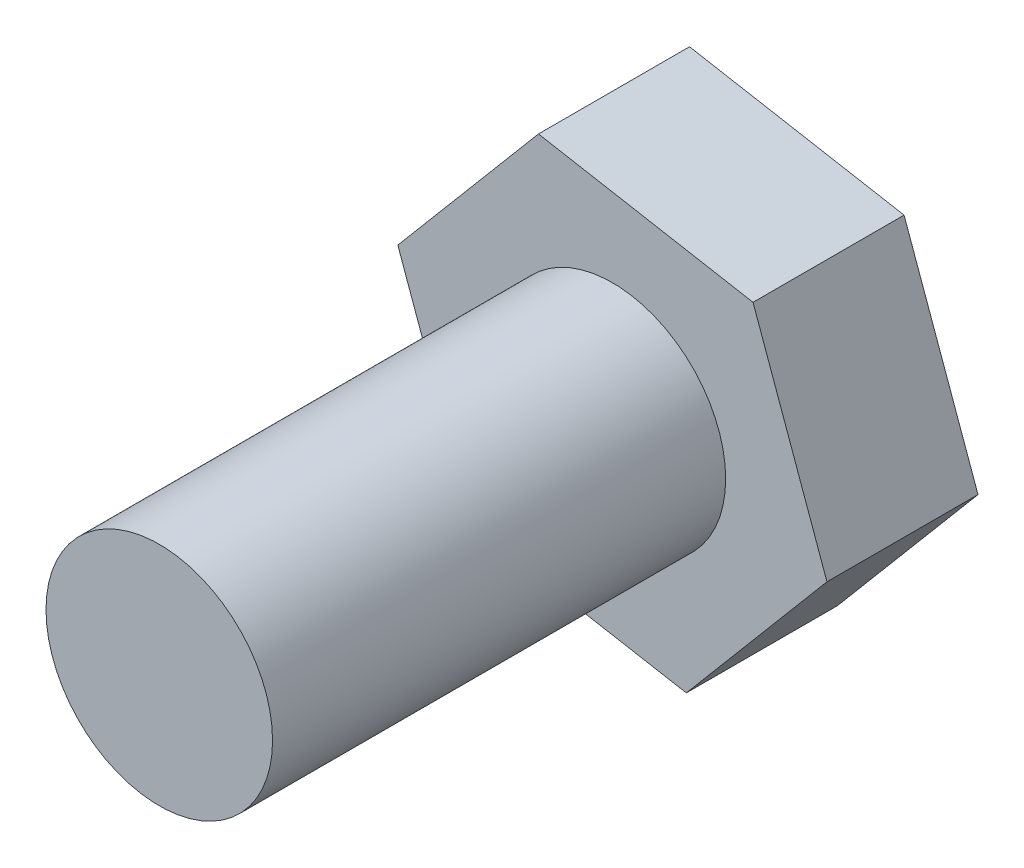
ISO-10303-21;
HEADER;
FILE_DESCRIPTION(('STEP AP214'),'2;1');
FILE_NAME('part.step','',(''),(''),'','','');
FILE_SCHEMA(('AUTOMOTIVE_DESIGN { 1 0 10303 214 1 1 1 1 }'));
ENDSEC;
DATA;
#1=APPLICATION_CONTEXT('core data for automotive mechanical design processes');
#2=APPLICATION_PROTOCOL_DEFINITION('international standard','automotive_design',2000,#1);
#3=PRODUCT_CONTEXT('',#1,'mechanical');
#4=PRODUCT('Part','Part','',(#3));
#5=PRODUCT_RELATED_PRODUCT_CATEGORY('part','',(#4));
#6=PRODUCT_DEFINITION_FORMATION('','',#4);
#7=PRODUCT_DEFINITION_CONTEXT('part definition',#1,'design');
#8=PRODUCT_DEFINITION('design','',#6,#7);
#9=PRODUCT_DEFINITION_SHAPE('','',#8);
#10=(LENGTH_UNIT() NAMED_UNIT(*) SI_UNIT(.MILLI.,.METRE.));
#11=(NAMED_UNIT(*) PLANE_ANGLE_UNIT() SI_UNIT($,.RADIAN.));
#12=(NAMED_UNIT(*) SI_UNIT($,.STERADIAN.) SOLID_ANGLE_UNIT());
#13=UNCERTAINTY_MEASURE_WITH_UNIT(LENGTH_MEASURE(1.E-05),#10,'distance_accuracy_value','');
#14=(GEOMETRIC_REPRESENTATION_CONTEXT(3) GLOBAL_UNCERTAINTY_ASSIGNED_CONTEXT((#13)) GLOBAL_UNIT_ASSIGNED_CONTEXT((#10,
#11,#12)) REPRESENTATION_CONTEXT('',''));
#15=CARTESIAN_POINT('',(0.,0.,0.));
#16=DIRECTION('',(0.,0.,1.));
#17=DIRECTION('',(1.,0.,0.));
#18=AXIS2_PLACEMENT_3D('',#15,#16,#17);
#19=CARTESIAN_POINT('',(0.,0.,4.));
#20=DIRECTION('',(0.,0.,1.));
#21=DIRECTION('',(1.,0.,0.));
#22=AXIS2_PLACEMENT_3D('',#19,#20,#21);
#23=PLANE('',#22);
#24=DIRECTION('',(0.339123555075527,-0.940741842586443,0.));
#25=VECTOR('',#24,1.);
#26=CARTESIAN_POINT('',(-5.68267459198921,1.0200700048985,4.));
#27=LINE('',#26,#25);
#28=CARTESIAN_POINT('',(-5.68267459198921,1.0200700048985,4.));
#29=VERTEX_POINT('',#28);
#30=CARTESIAN_POINT('',(-3.72474383387522,-4.41130555565377,4.));
#31=VERTEX_POINT('',#30);
#32=EDGE_CURVE('E133',#29,#31,#27,.T.);
#33=ORIENTED_EDGE('',*,*,#32,.T.);
#34=DIRECTION('',(0.984268111620605,-0.176681307576124,0.));
#35=VECTOR('',#34,1.);
#36=CARTESIAN_POINT('',(-3.72474383387522,-4.41130555565377,4.));
#37=LINE('',#36,#35);
#38=CARTESIAN_POINT('',(1.95793075811399,-5.43137556055227,4.));
#39=VERTEX_POINT('',#38);
#40=EDGE_CURVE('E91',#31,#39,#37,.T.);
#41=ORIENTED_EDGE('',*,*,#40,.T.);
#42=DIRECTION('',(0.645144556545077,0.76406053501032,0.));
#43=VECTOR('',#42,1.);
#44=CARTESIAN_POINT('',(1.95793075811399,-5.43137556055227,4.));
#45=LINE('',#44,#43);
#46=CARTESIAN_POINT('',(5.68267459198921,-1.0200700048985,4.));
#47=VERTEX_POINT('',#46);
#48=EDGE_CURVE('E104',#39,#47,#45,.T.);
#49=ORIENTED_EDGE('',*,*,#48,.T.);
#50=DIRECTION('',(-0.339123555075528,0.940741842586443,0.));
#51=VECTOR('',#50,1.);
#52=CARTESIAN_POINT('',(5.68267459198921,-1.0200700048985,4.));
#53=LINE('',#52,#51);
#54=CARTESIAN_POINT('',(3.72474383387522,4.41130555565378,4.));
#55=VERTEX_POINT('',#54);
#56=EDGE_CURVE('E98',#47,#55,#53,.T.);
#57=ORIENTED_EDGE('',*,*,#56,.T.);
#58=DIRECTION('',(-0.984268111620605,0.176681307576124,0.));
#59=VECTOR('',#58,1.);
#60=CARTESIAN_POINT('',(3.72474383387522,4.41130555565378,4.));
#61=LINE('',#60,#59);
#62=CARTESIAN_POINT('',(-1.95793075811399,5.43137556055227,4.));
#63=VERTEX_POINT('',#62);
#64=EDGE_CURVE('E102',#55,#63,#61,.T.);
#65=ORIENTED_EDGE('',*,*,#64,.T.);
#66=DIRECTION('',(-0.645144556545077,-0.76406053501032,0.));
#67=VECTOR('',#66,1.);
#68=CARTESIAN_POINT('',(-1.95793075811399,5.43137556055227,4.));
#69=LINE('',#68,#67);
#70=EDGE_CURVE('E54',#63,#29,#69,.T.);
#71=ORIENTED_EDGE('',*,*,#70,.T.);
#72=EDGE_LOOP('',(#33,#41,#49,#57,#65,#71));
#73=FACE_BOUND('',#72,.T.);
#74=CARTESIAN_POINT('',(0.,0.,4.));
#75=DIRECTION('',(0.,0.,1.));
#76=DIRECTION('',(1.,0.,0.));
#77=AXIS2_PLACEMENT_3D('',#74,#75,#76);
#78=CIRCLE('',#77,3.);
#79=CARTESIAN_POINT('',(3.,0.,4.));
#80=VERTEX_POINT('',#79);
#81=EDGE_CURVE('E173',#80,#80,#78,.T.);
#82=ORIENTED_EDGE('',*,*,#81,.F.);
#83=EDGE_LOOP('',(#82));
#84=FACE_BOUND('',#83,.T.);
#85=ADVANCED_FACE('F37',(#73,#84),#23,.T.);
#86=CARTESIAN_POINT('',(-5.68267459198921,1.0200700048985,4.));
#87=DIRECTION('',(0.940741842586443,0.339123555075527,0.));
#88=DIRECTION('',(-0.339123555075527,0.940741842586443,0.));
#89=AXIS2_PLACEMENT_3D('',#86,#87,#88);
#90=PLANE('',#89);
#91=DIRECTION('',(0.339123555075527,-0.940741842586443,0.));
#92=VECTOR('',#91,1.);
#93=CARTESIAN_POINT('',(-5.68267459198921,1.0200700048985,0.));
#94=LINE('',#93,#92);
#95=CARTESIAN_POINT('',(-5.68267459198921,1.0200700048985,0.));
#96=VERTEX_POINT('',#95);
#97=CARTESIAN_POINT('',(-3.72474383387522,-4.41130555565377,0.));
#98=VERTEX_POINT('',#97);
#99=EDGE_CURVE('E122',#96,#98,#94,.T.);
#100=ORIENTED_EDGE('',*,*,#99,.T.);
#101=DIRECTION('',(0.,0.,-1.));
#102=VECTOR('',#101,1.);
#103=CARTESIAN_POINT('',(-3.72474383387522,-4.41130555565377,4.));
#104=LINE('',#103,#102);
#105=EDGE_CURVE('E11',#31,#98,#104,.T.);
#106=ORIENTED_EDGE('',*,*,#105,.F.);
#107=ORIENTED_EDGE('',*,*,#32,.F.);
#108=DIRECTION('',(0.,0.,-1.));
#109=VECTOR('',#108,1.);
#110=CARTESIAN_POINT('',(-5.68267459198921,1.0200700048985,4.));
#111=LINE('',#110,#109);
#112=EDGE_CURVE('E118',#29,#96,#111,.T.);
#113=ORIENTED_EDGE('',*,*,#112,.T.);
#114=EDGE_LOOP('',(#100,#106,#107,#113));
#115=FACE_BOUND('',#114,.T.);
#116=ADVANCED_FACE('F39',(#115),#90,.F.);
#117=CARTESIAN_POINT('',(-3.72474383387522,-4.41130555565377,4.));
#118=DIRECTION('',(0.176681307576124,0.984268111620605,0.));
#119=DIRECTION('',(-0.984268111620605,0.176681307576124,0.));
#120=AXIS2_PLACEMENT_3D('',#117,#118,#119);
#121=PLANE('',#120);
#122=DIRECTION('',(0.984268111620605,-0.176681307576124,0.));
#123=VECTOR('',#122,1.);
#124=CARTESIAN_POINT('',(-3.72474383387522,-4.41130555565377,0.));
#125=LINE('',#124,#123);
#126=CARTESIAN_POINT('',(1.95793075811399,-5.43137556055227,0.));
#127=VERTEX_POINT('',#126);
#128=EDGE_CURVE('E125',#98,#127,#125,.T.);
#129=ORIENTED_EDGE('',*,*,#128,.T.);
#130=DIRECTION('',(0.,0.,-1.));
#131=VECTOR('',#130,1.);
#132=CARTESIAN_POINT('',(1.95793075811399,-5.43137556055227,4.));
#133=LINE('',#132,#131);
#134=EDGE_CURVE('E46',#39,#127,#133,.T.);
#135=ORIENTED_EDGE('',*,*,#134,.F.);
#136=ORIENTED_EDGE('',*,*,#40,.F.);
#137=ORIENTED_EDGE('',*,*,#105,.T.);
#138=EDGE_LOOP('',(#129,#135,#136,#137));
#139=FACE_BOUND('',#138,.T.);
#140=ADVANCED_FACE('F161',(#139),#121,.F.);
#141=CARTESIAN_POINT('',(1.95793075811399,-5.43137556055227,4.));
#142=DIRECTION('',(-0.76406053501032,0.645144556545077,0.));
#143=DIRECTION('',(-0.645144556545077,-0.76406053501032,0.));
#144=AXIS2_PLACEMENT_3D('',#141,#142,#143);
#145=PLANE('',#144);
#146=DIRECTION('',(0.645144556545077,0.76406053501032,0.));
#147=VECTOR('',#146,1.);
#148=CARTESIAN_POINT('',(1.95793075811399,-5.43137556055227,0.));
#149=LINE('',#148,#147);
#150=CARTESIAN_POINT('',(5.68267459198921,-1.0200700048985,0.));
#151=VERTEX_POINT('',#150);
#152=EDGE_CURVE('E128',#127,#151,#149,.T.);
#153=ORIENTED_EDGE('',*,*,#152,.T.);
#154=DIRECTION('',(0.,0.,-1.));
#155=VECTOR('',#154,1.);
#156=CARTESIAN_POINT('',(5.68267459198921,-1.0200700048985,4.));
#157=LINE('',#156,#155);
#158=EDGE_CURVE('E113',#47,#151,#157,.T.);
#159=ORIENTED_EDGE('',*,*,#158,.F.);
#160=ORIENTED_EDGE('',*,*,#48,.F.);
#161=ORIENTED_EDGE('',*,*,#134,.T.);
#162=EDGE_LOOP('',(#153,#159,#160,#161));
#163=FACE_BOUND('',#162,.T.);
#164=ADVANCED_FACE('F139',(#163),#145,.F.);
#165=CARTESIAN_POINT('',(5.68267459198921,-1.0200700048985,4.));
#166=DIRECTION('',(-0.940741842586443,-0.339123555075528,0.));
#167=DIRECTION('',(0.339123555075528,-0.940741842586443,0.));
#168=AXIS2_PLACEMENT_3D('',#165,#166,#167);
#169=PLANE('',#168);
#170=DIRECTION('',(-0.339123555075528,0.940741842586443,0.));
#171=VECTOR('',#170,1.);
#172=CARTESIAN_POINT('',(5.68267459198921,-1.0200700048985,0.));
#173=LINE('',#172,#171);
#174=CARTESIAN_POINT('',(3.72474383387522,4.41130555565378,0.));
#175=VERTEX_POINT('',#174);
#176=EDGE_CURVE('E112',#151,#175,#173,.T.);
#177=ORIENTED_EDGE('',*,*,#176,.T.);
#178=DIRECTION('',(0.,0.,-1.));
#179=VECTOR('',#178,1.);
#180=CARTESIAN_POINT('',(3.72474383387522,4.41130555565378,4.));
#181=LINE('',#180,#179);
#182=EDGE_CURVE('E109',#55,#175,#181,.T.);
#183=ORIENTED_EDGE('',*,*,#182,.F.);
#184=ORIENTED_EDGE('',*,*,#56,.F.);
#185=ORIENTED_EDGE('',*,*,#158,.T.);
#186=EDGE_LOOP('',(#177,#183,#184,#185));
#187=FACE_BOUND('',#186,.T.);
#188=ADVANCED_FACE('F110',(#187),#169,.F.);
#189=CARTESIAN_POINT('',(3.72474383387522,4.41130555565378,4.));
#190=DIRECTION('',(-0.176681307576124,-0.984268111620605,0.));
#191=DIRECTION('',(0.984268111620605,-0.176681307576124,0.));
#192=AXIS2_PLACEMENT_3D('',#189,#190,#191);
#193=PLANE('',#192);
#194=DIRECTION('',(-0.984268111620605,0.176681307576124,0.));
#195=VECTOR('',#194,1.);
#196=CARTESIAN_POINT('',(3.72474383387522,4.41130555565378,0.));
#197=LINE('',#196,#195);
#198=CARTESIAN_POINT('',(-1.95793075811399,5.43137556055227,0.));
#199=VERTEX_POINT('',#198);
#200=EDGE_CURVE('E77',#175,#199,#197,.T.);
#201=ORIENTED_EDGE('',*,*,#200,.T.);
#202=DIRECTION('',(0.,0.,-1.));
#203=VECTOR('',#202,1.);
#204=CARTESIAN_POINT('',(-1.95793075811399,5.43137556055227,4.));
#205=LINE('',#204,#203);
#206=EDGE_CURVE('E114',#63,#199,#205,.T.);
#207=ORIENTED_EDGE('',*,*,#206,.F.);
#208=ORIENTED_EDGE('',*,*,#64,.F.);
#209=ORIENTED_EDGE('',*,*,#182,.T.);
#210=EDGE_LOOP('',(#201,#207,#208,#209));
#211=FACE_BOUND('',#210,.T.);
#212=ADVANCED_FACE('F116',(#211),#193,.F.);
#213=CARTESIAN_POINT('',(-1.95793075811399,5.43137556055227,4.));
#214=DIRECTION('',(0.76406053501032,-0.645144556545077,0.));
#215=DIRECTION('',(0.645144556545077,0.76406053501032,0.));
#216=AXIS2_PLACEMENT_3D('',#213,#214,#215);
#217=PLANE('',#216);
#218=DIRECTION('',(-0.645144556545077,-0.76406053501032,0.));
#219=VECTOR('',#218,1.);
#220=CARTESIAN_POINT('',(-1.95793075811399,5.43137556055227,0.));
#221=LINE('',#220,#219);
#222=EDGE_CURVE('E83',#199,#96,#221,.T.);
#223=ORIENTED_EDGE('',*,*,#222,.T.);
#224=ORIENTED_EDGE('',*,*,#112,.F.);
#225=ORIENTED_EDGE('',*,*,#70,.F.);
#226=ORIENTED_EDGE('',*,*,#206,.T.);
#227=EDGE_LOOP('',(#223,#224,#225,#226));
#228=FACE_BOUND('',#227,.T.);
#229=ADVANCED_FACE('F146',(#228),#217,.F.);
#230=CARTESIAN_POINT('',(0.,0.,0.));
#231=DIRECTION('',(0.,0.,1.));
#232=DIRECTION('',(1.,0.,0.));
#233=AXIS2_PLACEMENT_3D('',#230,#231,#232);
#234=PLANE('',#233);
#235=ORIENTED_EDGE('',*,*,#99,.F.);
#236=ORIENTED_EDGE('',*,*,#222,.F.);
#237=ORIENTED_EDGE('',*,*,#200,.F.);
#238=ORIENTED_EDGE('',*,*,#176,.F.);
#239=ORIENTED_EDGE('',*,*,#152,.F.);
#240=ORIENTED_EDGE('',*,*,#128,.F.);
#241=EDGE_LOOP('',(#235,#236,#237,#238,#239,#240));
#242=FACE_BOUND('',#241,.T.);
#243=ADVANCED_FACE('F142',(#242),#234,.F.);
#244=CARTESIAN_POINT('',(0.,0.,16.));
#245=DIRECTION('',(0.,0.,-1.));
#246=DIRECTION('',(-1.,0.,0.));
#247=AXIS2_PLACEMENT_3D('',#244,#245,#246);
#248=CYLINDRICAL_SURFACE('',#247,3.);
#249=CARTESIAN_POINT('',(0.,0.,16.));
#250=DIRECTION('',(0.,0.,1.));
#251=DIRECTION('',(1.,0.,0.));
#252=AXIS2_PLACEMENT_3D('',#249,#250,#251);
#253=CIRCLE('',#252,3.);
#254=CARTESIAN_POINT('',(3.,0.,16.));
#255=VERTEX_POINT('',#254);
#256=EDGE_CURVE('E126',#255,#255,#253,.T.);
#257=ORIENTED_EDGE('',*,*,#256,.F.);
#258=EDGE_LOOP('',(#257));
#259=FACE_BOUND('',#258,.T.);
#260=ORIENTED_EDGE('',*,*,#81,.T.);
#261=EDGE_LOOP('',(#260));
#262=FACE_BOUND('',#261,.T.);
#263=ADVANCED_FACE('F153',(#259,#262),#248,.T.);
#264=CARTESIAN_POINT('',(0.,0.,16.));
#265=DIRECTION('',(0.,0.,1.));
#266=DIRECTION('',(1.,0.,0.));
#267=AXIS2_PLACEMENT_3D('',#264,#265,#266);
#268=PLANE('',#267);
#269=ORIENTED_EDGE('',*,*,#256,.T.);
#270=EDGE_LOOP('',(#269));
#271=FACE_BOUND('',#270,.T.);
#272=ADVANCED_FACE('F165',(#271),#268,.T.);
#273=CLOSED_SHELL('',(#85,#116,#140,#164,#188,#212,#229,#243,#263,#272));
#274=MANIFOLD_SOLID_BREP('B2',#273);
#275=ADVANCED_BREP_SHAPE_REPRESENTATION('',(#18,#274),#14);
#276=SHAPE_DEFINITION_REPRESENTATION(#9,#275);
ENDSEC;
END-ISO-10303-21;
